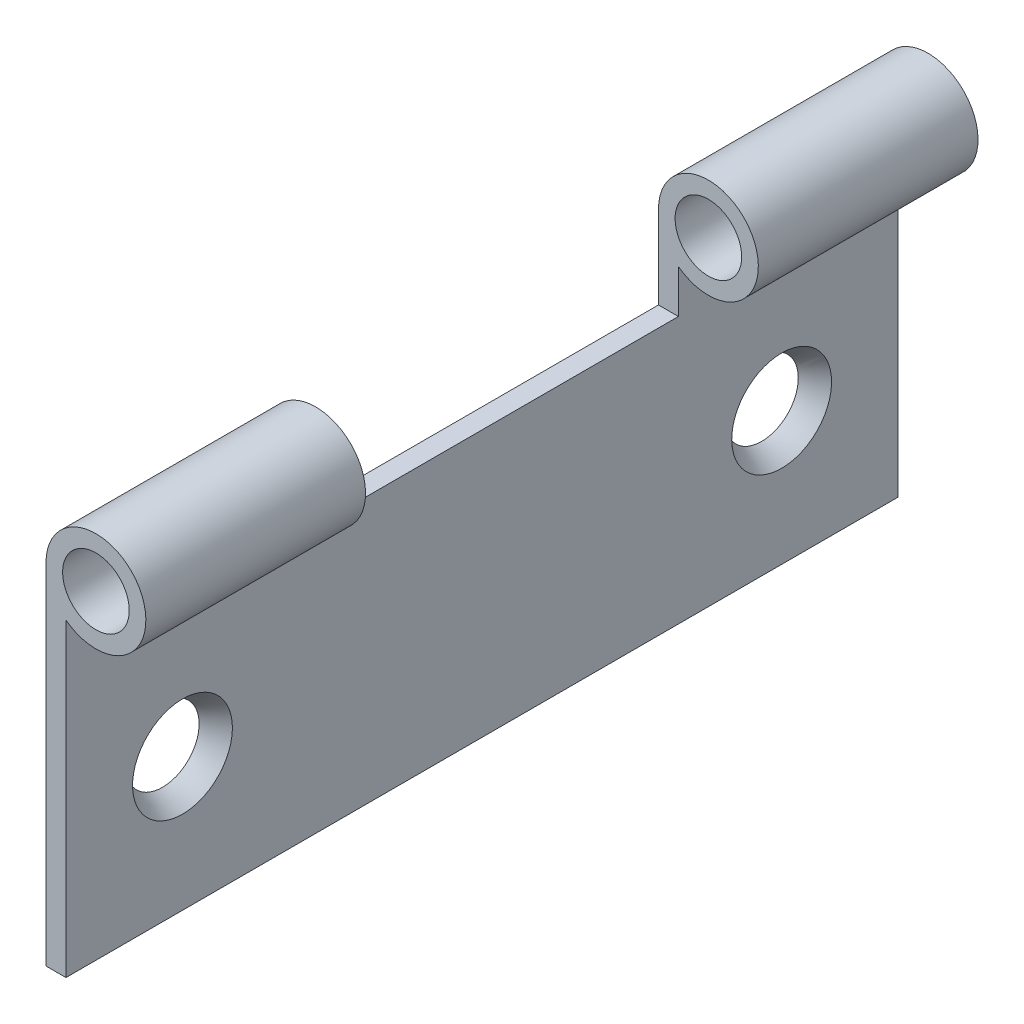
ISO-10303-21;
HEADER;
FILE_DESCRIPTION(('STEP AP214'),'2;1');
FILE_NAME('part.step','',(''),(''),'','','');
FILE_SCHEMA(('AUTOMOTIVE_DESIGN { 1 0 10303 214 1 1 1 1 }'));
ENDSEC;
DATA;
#1=APPLICATION_CONTEXT('core data for automotive mechanical design processes');
#2=APPLICATION_PROTOCOL_DEFINITION('international standard','automotive_design',2000,#1);
#3=PRODUCT_CONTEXT('',#1,'mechanical');
#4=PRODUCT('Part','Part','',(#3));
#5=PRODUCT_RELATED_PRODUCT_CATEGORY('part','',(#4));
#6=PRODUCT_DEFINITION_FORMATION('','',#4);
#7=PRODUCT_DEFINITION_CONTEXT('part definition',#1,'design');
#8=PRODUCT_DEFINITION('design','',#6,#7);
#9=PRODUCT_DEFINITION_SHAPE('','',#8);
#10=(LENGTH_UNIT() NAMED_UNIT(*) SI_UNIT(.MILLI.,.METRE.));
#11=(NAMED_UNIT(*) PLANE_ANGLE_UNIT() SI_UNIT($,.RADIAN.));
#12=(NAMED_UNIT(*) SI_UNIT($,.STERADIAN.) SOLID_ANGLE_UNIT());
#13=UNCERTAINTY_MEASURE_WITH_UNIT(LENGTH_MEASURE(1.E-05),#10,'distance_accuracy_value','');
#14=(GEOMETRIC_REPRESENTATION_CONTEXT(3) GLOBAL_UNCERTAINTY_ASSIGNED_CONTEXT((#13)) GLOBAL_UNIT_ASSIGNED_CONTEXT((#10,
#11,#12)) REPRESENTATION_CONTEXT('',''));
#15=CARTESIAN_POINT('',(0.,0.,0.));
#16=DIRECTION('',(0.,0.,1.));
#17=DIRECTION('',(1.,0.,0.));
#18=AXIS2_PLACEMENT_3D('',#15,#16,#17);
#19=CARTESIAN_POINT('',(1.5,10.5,-12.5));
#20=DIRECTION('',(0.,0.,1.));
#21=DIRECTION('',(1.,0.,0.));
#22=AXIS2_PLACEMENT_3D('',#19,#20,#21);
#23=CYLINDRICAL_SURFACE('',#22,1.5);
#24=CARTESIAN_POINT('',(1.5,10.5,5.9));
#25=DIRECTION('',(0.,0.,1.));
#26=DIRECTION('',(0.,-1.,0.));
#27=AXIS2_PLACEMENT_3D('',#24,#25,#26);
#28=CIRCLE('',#27,1.5);
#29=CARTESIAN_POINT('',(0.,10.5,5.9));
#30=VERTEX_POINT('',#29);
#31=CARTESIAN_POINT('',(0.6,9.3,5.9));
#32=VERTEX_POINT('',#31);
#33=EDGE_CURVE('E130',#30,#32,#28,.F.);
#34=ORIENTED_EDGE('',*,*,#33,.F.);
#35=DIRECTION('',(0.,0.,-1.));
#36=VECTOR('',#35,1.);
#37=CARTESIAN_POINT('',(0.,10.5,12.5));
#38=LINE('',#37,#36);
#39=CARTESIAN_POINT('',(0.,10.5,12.5));
#40=VERTEX_POINT('',#39);
#41=EDGE_CURVE('E47',#40,#30,#38,.T.);
#42=ORIENTED_EDGE('',*,*,#41,.F.);
#43=CARTESIAN_POINT('',(1.5,10.5,12.5));
#44=DIRECTION('',(0.,0.,1.));
#45=DIRECTION('',(1.,0.,0.));
#46=AXIS2_PLACEMENT_3D('',#43,#44,#45);
#47=CIRCLE('',#46,1.5);
#48=CARTESIAN_POINT('',(0.6,9.3,12.5));
#49=VERTEX_POINT('',#48);
#50=EDGE_CURVE('E145',#49,#40,#47,.T.);
#51=ORIENTED_EDGE('',*,*,#50,.F.);
#52=DIRECTION('',(0.,0.,1.));
#53=VECTOR('',#52,1.);
#54=CARTESIAN_POINT('',(0.6,9.3,-12.5));
#55=LINE('',#54,#53);
#56=EDGE_CURVE('E151',#32,#49,#55,.T.);
#57=ORIENTED_EDGE('',*,*,#56,.F.);
#58=EDGE_LOOP('',(#34,#42,#51,#57));
#59=FACE_BOUND('',#58,.T.);
#60=ADVANCED_FACE('F36',(#59),#23,.T.);
#61=CARTESIAN_POINT('',(1.5,10.5,-12.5));
#62=DIRECTION('',(0.,0.,1.));
#63=DIRECTION('',(1.,0.,0.));
#64=AXIS2_PLACEMENT_3D('',#61,#62,#63);
#65=CYLINDRICAL_SURFACE('',#64,1.);
#66=CARTESIAN_POINT('',(1.5,10.5,5.9));
#67=DIRECTION('',(0.,0.,1.));
#68=DIRECTION('',(0.,-1.,0.));
#69=AXIS2_PLACEMENT_3D('',#66,#67,#68);
#70=CIRCLE('',#69,1.);
#71=CARTESIAN_POINT('',(1.5,9.5,5.9));
#72=VERTEX_POINT('',#71);
#73=EDGE_CURVE('E134',#72,#72,#70,.F.);
#74=ORIENTED_EDGE('',*,*,#73,.T.);
#75=EDGE_LOOP('',(#74));
#76=FACE_BOUND('',#75,.T.);
#77=CARTESIAN_POINT('',(1.5,10.5,12.5));
#78=DIRECTION('',(0.,0.,1.));
#79=DIRECTION('',(1.,0.,0.));
#80=AXIS2_PLACEMENT_3D('',#77,#78,#79);
#81=CIRCLE('',#80,1.);
#82=CARTESIAN_POINT('',(2.5,10.5,12.5));
#83=VERTEX_POINT('',#82);
#84=EDGE_CURVE('E139',#83,#83,#81,.T.);
#85=ORIENTED_EDGE('',*,*,#84,.T.);
#86=EDGE_LOOP('',(#85));
#87=FACE_BOUND('',#86,.T.);
#88=ADVANCED_FACE('F293',(#76,#87),#65,.F.);
#89=CARTESIAN_POINT('',(0.6,0.,12.5));
#90=DIRECTION('',(-1.,0.,0.));
#91=DIRECTION('',(0.,0.,1.));
#92=AXIS2_PLACEMENT_3D('',#89,#90,#91);
#93=PLANE('',#92);
#94=CARTESIAN_POINT('',(0.6,4.,-9.));
#95=DIRECTION('',(-1.,0.,0.));
#96=DIRECTION('',(0.,0.,1.));
#97=AXIS2_PLACEMENT_3D('',#94,#95,#96);
#98=CIRCLE('',#97,1.5);
#99=CARTESIAN_POINT('',(0.6,4.81564072416819,-10.2588606789786));
#100=VERTEX_POINT('',#99);
#101=EDGE_CURVE('E215',#100,#100,#98,.T.);
#102=ORIENTED_EDGE('',*,*,#101,.T.);
#103=EDGE_LOOP('',(#102));
#104=FACE_BOUND('',#103,.T.);
#105=CARTESIAN_POINT('',(0.6,4.,9.));
#106=DIRECTION('',(1.,0.,0.));
#107=DIRECTION('',(0.,0.,-1.));
#108=AXIS2_PLACEMENT_3D('',#105,#106,#107);
#109=CIRCLE('',#108,1.5);
#110=CARTESIAN_POINT('',(0.6,4.81564072416819,10.2588606789786));
#111=VERTEX_POINT('',#110);
#112=EDGE_CURVE('E221',#111,#111,#109,.T.);
#113=ORIENTED_EDGE('',*,*,#112,.F.);
#114=EDGE_LOOP('',(#113));
#115=FACE_BOUND('',#114,.T.);
#116=DIRECTION('',(0.,0.,1.));
#117=VECTOR('',#116,1.);
#118=CARTESIAN_POINT('',(0.6,8.,12.5));
#119=LINE('',#118,#117);
#120=CARTESIAN_POINT('',(0.600000000000003,8.,-5.9));
#121=VERTEX_POINT('',#120);
#122=CARTESIAN_POINT('',(0.600000000000003,8.,5.9));
#123=VERTEX_POINT('',#122);
#124=EDGE_CURVE('E118',#121,#123,#119,.T.);
#125=ORIENTED_EDGE('',*,*,#124,.T.);
#126=DIRECTION('',(0.,1.,0.));
#127=VECTOR('',#126,1.);
#128=CARTESIAN_POINT('',(0.6,0.,5.9));
#129=LINE('',#128,#127);
#130=EDGE_CURVE('E129',#123,#32,#129,.T.);
#131=ORIENTED_EDGE('',*,*,#130,.T.);
#132=ORIENTED_EDGE('',*,*,#56,.T.);
#133=DIRECTION('',(0.,1.,0.));
#134=VECTOR('',#133,1.);
#135=CARTESIAN_POINT('',(0.6,0.,12.5));
#136=LINE('',#135,#134);
#137=CARTESIAN_POINT('',(0.6,0.,12.5));
#138=VERTEX_POINT('',#137);
#139=EDGE_CURVE('E164',#138,#49,#136,.T.);
#140=ORIENTED_EDGE('',*,*,#139,.F.);
#141=DIRECTION('',(0.,0.,-1.));
#142=VECTOR('',#141,1.);
#143=CARTESIAN_POINT('',(0.6,0.,12.5));
#144=LINE('',#143,#142);
#145=CARTESIAN_POINT('',(0.6,0.,-12.5));
#146=VERTEX_POINT('',#145);
#147=EDGE_CURVE('E63',#138,#146,#144,.T.);
#148=ORIENTED_EDGE('',*,*,#147,.T.);
#149=DIRECTION('',(0.,1.,0.));
#150=VECTOR('',#149,1.);
#151=CARTESIAN_POINT('',(0.6,0.,-12.5));
#152=LINE('',#151,#150);
#153=CARTESIAN_POINT('',(0.6,9.3,-12.5));
#154=VERTEX_POINT('',#153);
#155=EDGE_CURVE('E155',#146,#154,#152,.T.);
#156=ORIENTED_EDGE('',*,*,#155,.T.);
#157=CARTESIAN_POINT('',(0.6,9.3,-5.9));
#158=VERTEX_POINT('',#157);
#159=EDGE_CURVE('E152',#154,#158,#55,.T.);
#160=ORIENTED_EDGE('',*,*,#159,.T.);
#161=DIRECTION('',(0.,-1.,0.));
#162=VECTOR('',#161,1.);
#163=CARTESIAN_POINT('',(0.6,0.,-5.9));
#164=LINE('',#163,#162);
#165=EDGE_CURVE('E55',#158,#121,#164,.T.);
#166=ORIENTED_EDGE('',*,*,#165,.T.);
#167=EDGE_LOOP('',(#125,#131,#132,#140,#148,#156,#160,#166));
#168=FACE_BOUND('',#167,.T.);
#169=ADVANCED_FACE('F38',(#104,#115,#168),#93,.F.);
#170=CARTESIAN_POINT('',(0.,0.,12.5));
#171=DIRECTION('',(-1.,0.,0.));
#172=DIRECTION('',(0.,0.,1.));
#173=AXIS2_PLACEMENT_3D('',#170,#171,#172);
#174=PLANE('',#173);
#175=CARTESIAN_POINT('',(0.,4.,-9.));
#176=DIRECTION('',(1.,0.,0.));
#177=DIRECTION('',(0.,0.,-1.));
#178=AXIS2_PLACEMENT_3D('',#175,#176,#177);
#179=CIRCLE('',#178,1.1);
#180=CARTESIAN_POINT('',(0.,4.27422825846248,-10.0652693848321));
#181=VERTEX_POINT('',#180);
#182=EDGE_CURVE('E219',#181,#181,#179,.T.);
#183=ORIENTED_EDGE('',*,*,#182,.T.);
#184=EDGE_LOOP('',(#183));
#185=FACE_BOUND('',#184,.T.);
#186=CARTESIAN_POINT('',(0.,4.,9.));
#187=DIRECTION('',(-1.,0.,0.));
#188=DIRECTION('',(0.,0.,1.));
#189=AXIS2_PLACEMENT_3D('',#186,#187,#188);
#190=CIRCLE('',#189,1.1);
#191=CARTESIAN_POINT('',(0.,4.27422825846248,10.0652693848321));
#192=VERTEX_POINT('',#191);
#193=EDGE_CURVE('E184',#192,#192,#190,.T.);
#194=ORIENTED_EDGE('',*,*,#193,.F.);
#195=EDGE_LOOP('',(#194));
#196=FACE_BOUND('',#195,.T.);
#197=DIRECTION('',(0.,1.,0.));
#198=VECTOR('',#197,1.);
#199=CARTESIAN_POINT('',(0.,0.,5.9));
#200=LINE('',#199,#198);
#201=CARTESIAN_POINT('',(0.,8.,5.9));
#202=VERTEX_POINT('',#201);
#203=EDGE_CURVE('E125',#202,#30,#200,.T.);
#204=ORIENTED_EDGE('',*,*,#203,.F.);
#205=DIRECTION('',(0.,0.,1.));
#206=VECTOR('',#205,1.);
#207=CARTESIAN_POINT('',(0.,8.,12.5));
#208=LINE('',#207,#206);
#209=CARTESIAN_POINT('',(0.,8.,-5.9));
#210=VERTEX_POINT('',#209);
#211=EDGE_CURVE('E12',#210,#202,#208,.T.);
#212=ORIENTED_EDGE('',*,*,#211,.F.);
#213=DIRECTION('',(0.,-1.,0.));
#214=VECTOR('',#213,1.);
#215=CARTESIAN_POINT('',(0.,0.,-5.9));
#216=LINE('',#215,#214);
#217=CARTESIAN_POINT('',(0.,10.5,-5.9));
#218=VERTEX_POINT('',#217);
#219=EDGE_CURVE('E104',#218,#210,#216,.T.);
#220=ORIENTED_EDGE('',*,*,#219,.F.);
#221=CARTESIAN_POINT('',(0.,10.5,-12.5));
#222=VERTEX_POINT('',#221);
#223=EDGE_CURVE('E174',#218,#222,#38,.T.);
#224=ORIENTED_EDGE('',*,*,#223,.T.);
#225=DIRECTION('',(0.,1.,0.));
#226=VECTOR('',#225,1.);
#227=CARTESIAN_POINT('',(0.,0.,-12.5));
#228=LINE('',#227,#226);
#229=CARTESIAN_POINT('',(0.,0.,-12.5));
#230=VERTEX_POINT('',#229);
#231=EDGE_CURVE('E158',#230,#222,#228,.T.);
#232=ORIENTED_EDGE('',*,*,#231,.F.);
#233=DIRECTION('',(0.,0.,-1.));
#234=VECTOR('',#233,1.);
#235=CARTESIAN_POINT('',(0.,0.,12.5));
#236=LINE('',#235,#234);
#237=CARTESIAN_POINT('',(0.,0.,12.5));
#238=VERTEX_POINT('',#237);
#239=EDGE_CURVE('E172',#238,#230,#236,.T.);
#240=ORIENTED_EDGE('',*,*,#239,.F.);
#241=DIRECTION('',(0.,1.,0.));
#242=VECTOR('',#241,1.);
#243=CARTESIAN_POINT('',(0.,0.,12.5));
#244=LINE('',#243,#242);
#245=EDGE_CURVE('E167',#238,#40,#244,.T.);
#246=ORIENTED_EDGE('',*,*,#245,.T.);
#247=ORIENTED_EDGE('',*,*,#41,.T.);
#248=EDGE_LOOP('',(#204,#212,#220,#224,#232,#240,#246,#247));
#249=FACE_BOUND('',#248,.T.);
#250=ADVANCED_FACE('F123',(#185,#196,#249),#174,.T.);
#251=CARTESIAN_POINT('',(0.6,0.,12.5));
#252=DIRECTION('',(0.,-1.,0.));
#253=DIRECTION('',(0.,0.,-1.));
#254=AXIS2_PLACEMENT_3D('',#251,#252,#253);
#255=PLANE('',#254);
#256=DIRECTION('',(-1.,0.,0.));
#257=VECTOR('',#256,1.);
#258=CARTESIAN_POINT('',(0.6,0.,-12.5));
#259=LINE('',#258,#257);
#260=EDGE_CURVE('E161',#146,#230,#259,.T.);
#261=ORIENTED_EDGE('',*,*,#260,.F.);
#262=ORIENTED_EDGE('',*,*,#147,.F.);
#263=DIRECTION('',(-1.,0.,0.));
#264=VECTOR('',#263,1.);
#265=CARTESIAN_POINT('',(0.6,0.,12.5));
#266=LINE('',#265,#264);
#267=EDGE_CURVE('E169',#138,#238,#266,.T.);
#268=ORIENTED_EDGE('',*,*,#267,.T.);
#269=ORIENTED_EDGE('',*,*,#239,.T.);
#270=EDGE_LOOP('',(#261,#262,#268,#269));
#271=FACE_BOUND('',#270,.T.);
#272=ADVANCED_FACE('F198',(#271),#255,.T.);
#273=CARTESIAN_POINT('',(0.6,10.5,12.5));
#274=DIRECTION('',(0.,0.,-1.));
#275=DIRECTION('',(-1.,0.,0.));
#276=AXIS2_PLACEMENT_3D('',#273,#274,#275);
#277=PLANE('',#276);
#278=ORIENTED_EDGE('',*,*,#84,.F.);
#279=EDGE_LOOP('',(#278));
#280=FACE_BOUND('',#279,.T.);
#281=ORIENTED_EDGE('',*,*,#139,.T.);
#282=ORIENTED_EDGE('',*,*,#50,.T.);
#283=ORIENTED_EDGE('',*,*,#245,.F.);
#284=ORIENTED_EDGE('',*,*,#267,.F.);
#285=EDGE_LOOP('',(#281,#282,#283,#284));
#286=FACE_BOUND('',#285,.T.);
#287=ADVANCED_FACE('F285',(#280,#286),#277,.F.);
#288=CARTESIAN_POINT('',(0.6,10.5,-12.5));
#289=DIRECTION('',(0.,0.,-1.));
#290=DIRECTION('',(-1.,0.,0.));
#291=AXIS2_PLACEMENT_3D('',#288,#289,#290);
#292=PLANE('',#291);
#293=CARTESIAN_POINT('',(1.5,10.5,-12.5));
#294=DIRECTION('',(0.,0.,1.));
#295=DIRECTION('',(1.,0.,0.));
#296=AXIS2_PLACEMENT_3D('',#293,#294,#295);
#297=CIRCLE('',#296,1.);
#298=CARTESIAN_POINT('',(2.5,10.5,-12.5));
#299=VERTEX_POINT('',#298);
#300=EDGE_CURVE('E142',#299,#299,#297,.T.);
#301=ORIENTED_EDGE('',*,*,#300,.T.);
#302=EDGE_LOOP('',(#301));
#303=FACE_BOUND('',#302,.T.);
#304=ORIENTED_EDGE('',*,*,#231,.T.);
#305=CARTESIAN_POINT('',(1.5,10.5,-12.5));
#306=DIRECTION('',(0.,0.,1.));
#307=DIRECTION('',(1.,0.,0.));
#308=AXIS2_PLACEMENT_3D('',#305,#306,#307);
#309=CIRCLE('',#308,1.5);
#310=EDGE_CURVE('E148',#154,#222,#309,.T.);
#311=ORIENTED_EDGE('',*,*,#310,.F.);
#312=ORIENTED_EDGE('',*,*,#155,.F.);
#313=ORIENTED_EDGE('',*,*,#260,.T.);
#314=EDGE_LOOP('',(#304,#311,#312,#313));
#315=FACE_BOUND('',#314,.T.);
#316=ADVANCED_FACE('F280',(#303,#315),#292,.T.);
#317=CARTESIAN_POINT('',(1.5,10.5,-5.9));
#318=DIRECTION('',(0.,0.,-1.));
#319=DIRECTION('',(0.,1.,0.));
#320=AXIS2_PLACEMENT_3D('',#317,#318,#319);
#321=CIRCLE('',#320,1.5);
#322=EDGE_CURVE('E108',#158,#218,#321,.F.);
#323=ORIENTED_EDGE('',*,*,#322,.F.);
#324=ORIENTED_EDGE('',*,*,#159,.F.);
#325=ORIENTED_EDGE('',*,*,#310,.T.);
#326=ORIENTED_EDGE('',*,*,#223,.F.);
#327=EDGE_LOOP('',(#323,#324,#325,#326));
#328=FACE_BOUND('',#327,.T.);
#329=ADVANCED_FACE('F278',(#328),#23,.T.);
#330=CARTESIAN_POINT('',(1.5,10.5,-5.9));
#331=DIRECTION('',(0.,0.,-1.));
#332=DIRECTION('',(0.,1.,0.));
#333=AXIS2_PLACEMENT_3D('',#330,#331,#332);
#334=CIRCLE('',#333,1.);
#335=CARTESIAN_POINT('',(1.5,11.5,-5.9));
#336=VERTEX_POINT('',#335);
#337=EDGE_CURVE('E119',#336,#336,#334,.F.);
#338=ORIENTED_EDGE('',*,*,#337,.T.);
#339=EDGE_LOOP('',(#338));
#340=FACE_BOUND('',#339,.T.);
#341=ORIENTED_EDGE('',*,*,#300,.F.);
#342=EDGE_LOOP('',(#341));
#343=FACE_BOUND('',#342,.T.);
#344=ADVANCED_FACE('F301',(#340,#343),#65,.F.);
#345=CARTESIAN_POINT('',(-59.4,8.,5.9));
#346=DIRECTION('',(0.,-1.,0.));
#347=DIRECTION('',(0.,0.,-1.));
#348=AXIS2_PLACEMENT_3D('',#345,#346,#347);
#349=PLANE('',#348);
#350=DIRECTION('',(1.,0.,0.));
#351=VECTOR('',#350,1.);
#352=CARTESIAN_POINT('',(-59.4,8.,-5.9));
#353=LINE('',#352,#351);
#354=EDGE_CURVE('E107',#210,#121,#353,.T.);
#355=ORIENTED_EDGE('',*,*,#354,.F.);
#356=ORIENTED_EDGE('',*,*,#211,.T.);
#357=DIRECTION('',(1.,0.,0.));
#358=VECTOR('',#357,1.);
#359=CARTESIAN_POINT('',(-59.4,8.,5.9));
#360=LINE('',#359,#358);
#361=EDGE_CURVE('E120',#202,#123,#360,.T.);
#362=ORIENTED_EDGE('',*,*,#361,.T.);
#363=ORIENTED_EDGE('',*,*,#124,.F.);
#364=EDGE_LOOP('',(#355,#356,#362,#363));
#365=FACE_BOUND('',#364,.T.);
#366=ADVANCED_FACE('F114',(#365),#349,.F.);
#367=CARTESIAN_POINT('',(-59.4,14.,5.9));
#368=DIRECTION('',(0.,0.,1.));
#369=DIRECTION('',(0.,-1.,0.));
#370=AXIS2_PLACEMENT_3D('',#367,#368,#369);
#371=PLANE('',#370);
#372=ORIENTED_EDGE('',*,*,#73,.F.);
#373=EDGE_LOOP('',(#372));
#374=FACE_BOUND('',#373,.T.);
#375=ORIENTED_EDGE('',*,*,#361,.F.);
#376=ORIENTED_EDGE('',*,*,#203,.T.);
#377=ORIENTED_EDGE('',*,*,#33,.T.);
#378=ORIENTED_EDGE('',*,*,#130,.F.);
#379=EDGE_LOOP('',(#375,#376,#377,#378));
#380=FACE_BOUND('',#379,.T.);
#381=ADVANCED_FACE('F363',(#374,#380),#371,.F.);
#382=CARTESIAN_POINT('',(-59.4,14.,-5.9));
#383=DIRECTION('',(0.,0.,-1.));
#384=DIRECTION('',(0.,1.,0.));
#385=AXIS2_PLACEMENT_3D('',#382,#383,#384);
#386=PLANE('',#385);
#387=ORIENTED_EDGE('',*,*,#337,.F.);
#388=EDGE_LOOP('',(#387));
#389=FACE_BOUND('',#388,.T.);
#390=ORIENTED_EDGE('',*,*,#322,.T.);
#391=ORIENTED_EDGE('',*,*,#219,.T.);
#392=ORIENTED_EDGE('',*,*,#354,.T.);
#393=ORIENTED_EDGE('',*,*,#165,.F.);
#394=EDGE_LOOP('',(#390,#391,#392,#393));
#395=FACE_BOUND('',#394,.T.);
#396=ADVANCED_FACE('F106',(#389,#395),#386,.F.);
#397=CARTESIAN_POINT('',(0.,4.27422825846248,10.0652693848321));
#398=CARTESIAN_POINT('',(0.6,4.81564072416819,10.2588606789786));
#399=CARTESIAN_POINT('',(0.,2.14368948879821,10.6137259017571));
#400=CARTESIAN_POINT('',(0.6,2.29791936621104,11.8901421273149));
#401=CARTESIAN_POINT('',(0.,1.59523297187325,8.48318713209283));
#402=CARTESIAN_POINT('',(0.6,0.666637917874665,9.3724207693578));
#403=CARTESIAN_POINT('',(0.,3.72577174153752,7.93473061516786));
#404=CARTESIAN_POINT('',(0.6,3.18435927583181,7.74113932102142));
#405=CARTESIAN_POINT('',(0.,5.85631051120179,7.38627409824289));
#406=CARTESIAN_POINT('',(0.6,5.70208063378896,6.10985787268505));
#407=CARTESIAN_POINT('',(0.,6.40476702812675,9.51681286790717));
#408=CARTESIAN_POINT('',(0.6,7.33336208212534,8.62757923064219));
#409=CARTESIAN_POINT('',(0.,4.27422825846248,10.0652693848321));
#410=CARTESIAN_POINT('',(0.6,4.81564072416819,10.2588606789786));
#411=(BOUNDED_SURFACE() B_SPLINE_SURFACE(3,1,((#397,#398),(#399,#400),(#401,#402),(#403,#404),
(#405,#406),(#407,#408),(#409,#410)),.UNSPECIFIED.,.T.,.F.,.F.) B_SPLINE_SURFACE_WITH_KNOTS((4,
3,4),(2,2),(0.,0.5,1.),(0.,1.),
.UNSPECIFIED.) GEOMETRIC_REPRESENTATION_ITEM() RATIONAL_B_SPLINE_SURFACE(((1.,1.),
(0.333333333333333,0.333333333333333),(0.333333333333333,0.333333333333333),(1.,1.),
(0.333333333333333,0.333333333333333),(0.333333333333333,0.333333333333333),(1.,1.))) REPRESENTATION_ITEM('') SURFACE());
#412=CARTESIAN_POINT('',(0.,4.27422825846248,10.0652693848321));
#413=CARTESIAN_POINT('',(0.00625000000000054,4.27986797164692,10.0672859608128));
#414=CARTESIAN_POINT('',(0.0125000000000004,4.28550768483135,10.0693025367935));
#415=CARTESIAN_POINT('',(0.025,4.29678711120022,10.0733356887549));
#416=CARTESIAN_POINT('',(0.0312499999999998,4.30242682438466,10.0753522647356));
#417=CARTESIAN_POINT('',(0.0437499999999998,4.31370625075353,10.079385416697));
#418=CARTESIAN_POINT('',(0.05,4.31934596393796,10.0814019926777));
#419=CARTESIAN_POINT('',(0.0625000000000001,4.33062539030683,10.0854351446391));
#420=CARTESIAN_POINT('',(0.06875,4.33626510349126,10.0874517206197));
#421=CARTESIAN_POINT('',(0.08125,4.34754452986013,10.0914848725811));
#422=CARTESIAN_POINT('',(0.0875,4.35318424304457,10.0935014485618));
#423=CARTESIAN_POINT('',(0.1,4.36446366941343,10.0975346005232));
#424=CARTESIAN_POINT('',(0.10625,4.37010338259787,10.0995511765039));
#425=CARTESIAN_POINT('',(0.11875,4.38138280896674,10.1035843284653));
#426=CARTESIAN_POINT('',(0.125,4.38702252215117,10.105600904446));
#427=CARTESIAN_POINT('',(0.1375,4.39830194852004,10.1096340564074));
#428=CARTESIAN_POINT('',(0.14375,4.40394166170448,10.1116506323881));
#429=CARTESIAN_POINT('',(0.15625,4.41522108807334,10.1156837843494));
#430=CARTESIAN_POINT('',(0.1625,4.42086080125778,10.1177003603301));
#431=CARTESIAN_POINT('',(0.175,4.43214022762665,10.1217335122915));
#432=CARTESIAN_POINT('',(0.18125,4.43777994081108,10.1237500882722));
#433=CARTESIAN_POINT('',(0.19375,4.44905936717995,10.1277832402336));
#434=CARTESIAN_POINT('',(0.2,4.45469908036439,10.1297998162143));
#435=CARTESIAN_POINT('',(0.2125,4.46597850673325,10.1338329681757));
#436=CARTESIAN_POINT('',(0.21875,4.47161821991769,10.1358495441564));
#437=CARTESIAN_POINT('',(0.23125,4.48289764628656,10.1398826961177));
#438=CARTESIAN_POINT('',(0.2375,4.48853735947099,10.1418992720984));
#439=CARTESIAN_POINT('',(0.25,4.49981678583986,10.1459324240598));
#440=CARTESIAN_POINT('',(0.25625,4.5054564990243,10.1479490000405));
#441=CARTESIAN_POINT('',(0.26875,4.51673592539316,10.1519821520019));
#442=CARTESIAN_POINT('',(0.275,4.5223756385776,10.1539987279826));
#443=CARTESIAN_POINT('',(0.2875,4.53365506494647,10.158031879944));
#444=CARTESIAN_POINT('',(0.29375,4.5392947781309,10.1600484559247));
#445=CARTESIAN_POINT('',(0.30625,4.55057420449977,10.164081607886));
#446=CARTESIAN_POINT('',(0.3125,4.55621391768421,10.1660981838667));
#447=CARTESIAN_POINT('',(0.325,4.56749334405307,10.1701313358281));
#448=CARTESIAN_POINT('',(0.33125,4.57313305723751,10.1721479118088));
#449=CARTESIAN_POINT('',(0.34375,4.58441248360638,10.1761810637702));
#450=CARTESIAN_POINT('',(0.35,4.59005219679081,10.1781976397509));
#451=CARTESIAN_POINT('',(0.3625,4.60133162315968,10.1822307917123));
#452=CARTESIAN_POINT('',(0.36875,4.60697133634412,10.184247367693));
#453=CARTESIAN_POINT('',(0.38125,4.61825076271298,10.1882805196544));
#454=CARTESIAN_POINT('',(0.3875,4.62389047589742,10.190297095635));
#455=CARTESIAN_POINT('',(0.4,4.63516990226629,10.1943302475964));
#456=CARTESIAN_POINT('',(0.40625,4.64080961545072,10.1963468235771));
#457=CARTESIAN_POINT('',(0.41875,4.65208904181959,10.2003799755385));
#458=CARTESIAN_POINT('',(0.425,4.65772875500403,10.2023965515192));
#459=CARTESIAN_POINT('',(0.4375,4.66900818137289,10.2064297034806));
#460=CARTESIAN_POINT('',(0.44375,4.67464789455733,10.2084462794613));
#461=CARTESIAN_POINT('',(0.45625,4.6859273209262,10.2124794314227));
#462=CARTESIAN_POINT('',(0.4625,4.69156703411063,10.2144960074033));
#463=CARTESIAN_POINT('',(0.475,4.7028464604795,10.2185291593647));
#464=CARTESIAN_POINT('',(0.48125,4.70848617366394,10.2205457353454));
#465=CARTESIAN_POINT('',(0.49375,4.7197656000328,10.2245788873068));
#466=CARTESIAN_POINT('',(0.5,4.72540531321724,10.2265954632875));
#467=CARTESIAN_POINT('',(0.5125,4.73668473958611,10.2306286152489));
#468=CARTESIAN_POINT('',(0.51875,4.74232445277054,10.2326451912296));
#469=CARTESIAN_POINT('',(0.53125,4.75360387913941,10.236678343191));
#470=CARTESIAN_POINT('',(0.5375,4.75924359232384,10.2386949191716));
#471=CARTESIAN_POINT('',(0.55,4.77052301869271,10.242728071133));
#472=CARTESIAN_POINT('',(0.55625,4.77616273187715,10.2447446471137));
#473=CARTESIAN_POINT('',(0.56875,4.78744215824602,10.2487777990751));
#474=CARTESIAN_POINT('',(0.575,4.79308187143045,10.2507943750558));
#475=CARTESIAN_POINT('',(0.5875,4.80436129779932,10.2548275270172));
#476=CARTESIAN_POINT('',(0.593749999999999,4.81000101098375,10.2568441029979));
#477=CARTESIAN_POINT('',(0.6,4.81564072416819,10.2588606789786));
#478=B_SPLINE_CURVE_WITH_KNOTS('',3,(#412,#413,#414,#415,#416,#417,#418,#419,#420,#421,#422,
#423,#424,#425,#426,#427,#428,#429,#430,#431,#432,#433,#434,#435,#436,#437,#438,#439,#440,#441,
#442,#443,#444,#445,#446,#447,#448,#449,#450,#451,#452,#453,#454,#455,#456,#457,#458,#459,#460,
#461,#462,#463,#464,#465,#466,#467,#468,#469,#470,#471,#472,#473,#474,#475,#476,#477),
.UNSPECIFIED.,.F.,.F.,(4,2,2,2,2,2,2,2,2,2,2,2,2,2,2,2,2,2,2,2,2,2,2,2,2,2,2,2,2,2,2,2,4),(0.,
0.0259695781905919,0.0519391563811853,0.0779087345717771,0.103878312762369,0.129847890952962,
0.155817469143554,0.181787047334147,0.207756625524739,0.233726203715331,0.259695781905923,
0.285665360096516,0.311634938287108,0.337604516477701,0.363574094668293,0.389543672858885,
0.415513251049477,0.44148282924007,0.467452407430663,0.493421985621255,0.519391563811847,
0.545361142002439,0.571330720193031,0.597300298383624,0.623269876574217,0.649239454764809,
0.675209032955401,0.701178611145993,0.727148189336586,0.753117767527178,0.77908734571777,
0.805056923908363,0.831026502098955),.UNSPECIFIED.);
#479=EDGE_CURVE('BSEAM236',#192,#111,#478,.T.);
#480=ORIENTED_EDGE('',*,*,#193,.T.);
#481=ORIENTED_EDGE('',*,*,#112,.T.);
#482=ORIENTED_EDGE('',*,*,#479,.T.);
#483=ORIENTED_EDGE('',*,*,#479,.F.);
#484=EDGE_LOOP('',(#480,#482,#481,#483));
#485=FACE_BOUND('',#484,.T.);
#486=ADVANCED_FACE('F236',(#485),#411,.F.);
#487=CARTESIAN_POINT('',(0.,4.27422825846248,-10.0652693848321));
#488=CARTESIAN_POINT('',(0.6,4.81564072416819,-10.2588606789786));
#489=CARTESIAN_POINT('',(0.,2.14368948879821,-10.6137259017571));
#490=CARTESIAN_POINT('',(0.6,2.29791936621104,-11.8901421273149));
#491=CARTESIAN_POINT('',(0.,1.59523297187325,-8.48318713209283));
#492=CARTESIAN_POINT('',(0.6,0.666637917874665,-9.3724207693578));
#493=CARTESIAN_POINT('',(0.,3.72577174153752,-7.93473061516786));
#494=CARTESIAN_POINT('',(0.6,3.18435927583181,-7.74113932102142));
#495=CARTESIAN_POINT('',(0.,5.85631051120179,-7.38627409824289));
#496=CARTESIAN_POINT('',(0.6,5.70208063378896,-6.10985787268505));
#497=CARTESIAN_POINT('',(0.,6.40476702812675,-9.51681286790717));
#498=CARTESIAN_POINT('',(0.6,7.33336208212534,-8.62757923064219));
#499=CARTESIAN_POINT('',(0.,4.27422825846248,-10.0652693848321));
#500=CARTESIAN_POINT('',(0.6,4.81564072416819,-10.2588606789786));
#501=(BOUNDED_SURFACE() B_SPLINE_SURFACE(3,1,((#487,#488),(#489,#490),(#491,#492),(#493,#494),
(#495,#496),(#497,#498),(#499,#500)),.UNSPECIFIED.,.T.,.F.,.F.) B_SPLINE_SURFACE_WITH_KNOTS((4,
3,4),(2,2),(0.,0.5,1.),(0.,1.),
.UNSPECIFIED.) GEOMETRIC_REPRESENTATION_ITEM() RATIONAL_B_SPLINE_SURFACE(((1.,1.),
(0.333333333333333,0.333333333333333),(0.333333333333333,0.333333333333333),(1.,1.),
(0.333333333333333,0.333333333333333),(0.333333333333333,0.333333333333333),(1.,1.))) REPRESENTATION_ITEM('') SURFACE());
#502=CARTESIAN_POINT('',(0.,4.27422825846248,-10.0652693848321));
#503=CARTESIAN_POINT('',(0.00625000000000054,4.27986797164692,-10.0672859608128));
#504=CARTESIAN_POINT('',(0.0125000000000004,4.28550768483135,-10.0693025367935));
#505=CARTESIAN_POINT('',(0.025,4.29678711120022,-10.0733356887549));
#506=CARTESIAN_POINT('',(0.0312499999999998,4.30242682438466,-10.0753522647356));
#507=CARTESIAN_POINT('',(0.0437499999999998,4.31370625075353,-10.079385416697));
#508=CARTESIAN_POINT('',(0.05,4.31934596393796,-10.0814019926777));
#509=CARTESIAN_POINT('',(0.0625000000000001,4.33062539030683,-10.0854351446391));
#510=CARTESIAN_POINT('',(0.06875,4.33626510349126,-10.0874517206197));
#511=CARTESIAN_POINT('',(0.08125,4.34754452986013,-10.0914848725811));
#512=CARTESIAN_POINT('',(0.0875,4.35318424304457,-10.0935014485618));
#513=CARTESIAN_POINT('',(0.1,4.36446366941343,-10.0975346005232));
#514=CARTESIAN_POINT('',(0.10625,4.37010338259787,-10.0995511765039));
#515=CARTESIAN_POINT('',(0.11875,4.38138280896674,-10.1035843284653));
#516=CARTESIAN_POINT('',(0.125,4.38702252215117,-10.105600904446));
#517=CARTESIAN_POINT('',(0.1375,4.39830194852004,-10.1096340564074));
#518=CARTESIAN_POINT('',(0.14375,4.40394166170448,-10.1116506323881));
#519=CARTESIAN_POINT('',(0.15625,4.41522108807334,-10.1156837843494));
#520=CARTESIAN_POINT('',(0.1625,4.42086080125778,-10.1177003603301));
#521=CARTESIAN_POINT('',(0.175,4.43214022762665,-10.1217335122915));
#522=CARTESIAN_POINT('',(0.18125,4.43777994081108,-10.1237500882722));
#523=CARTESIAN_POINT('',(0.19375,4.44905936717995,-10.1277832402336));
#524=CARTESIAN_POINT('',(0.2,4.45469908036439,-10.1297998162143));
#525=CARTESIAN_POINT('',(0.2125,4.46597850673325,-10.1338329681757));
#526=CARTESIAN_POINT('',(0.21875,4.47161821991769,-10.1358495441564));
#527=CARTESIAN_POINT('',(0.23125,4.48289764628656,-10.1398826961177));
#528=CARTESIAN_POINT('',(0.2375,4.48853735947099,-10.1418992720984));
#529=CARTESIAN_POINT('',(0.25,4.49981678583986,-10.1459324240598));
#530=CARTESIAN_POINT('',(0.25625,4.5054564990243,-10.1479490000405));
#531=CARTESIAN_POINT('',(0.26875,4.51673592539316,-10.1519821520019));
#532=CARTESIAN_POINT('',(0.275,4.5223756385776,-10.1539987279826));
#533=CARTESIAN_POINT('',(0.2875,4.53365506494647,-10.158031879944));
#534=CARTESIAN_POINT('',(0.29375,4.5392947781309,-10.1600484559247));
#535=CARTESIAN_POINT('',(0.30625,4.55057420449977,-10.164081607886));
#536=CARTESIAN_POINT('',(0.3125,4.55621391768421,-10.1660981838667));
#537=CARTESIAN_POINT('',(0.325,4.56749334405307,-10.1701313358281));
#538=CARTESIAN_POINT('',(0.33125,4.57313305723751,-10.1721479118088));
#539=CARTESIAN_POINT('',(0.34375,4.58441248360638,-10.1761810637702));
#540=CARTESIAN_POINT('',(0.35,4.59005219679081,-10.1781976397509));
#541=CARTESIAN_POINT('',(0.3625,4.60133162315968,-10.1822307917123));
#542=CARTESIAN_POINT('',(0.36875,4.60697133634412,-10.184247367693));
#543=CARTESIAN_POINT('',(0.38125,4.61825076271298,-10.1882805196544));
#544=CARTESIAN_POINT('',(0.3875,4.62389047589742,-10.190297095635));
#545=CARTESIAN_POINT('',(0.4,4.63516990226629,-10.1943302475964));
#546=CARTESIAN_POINT('',(0.40625,4.64080961545072,-10.1963468235771));
#547=CARTESIAN_POINT('',(0.41875,4.65208904181959,-10.2003799755385));
#548=CARTESIAN_POINT('',(0.425,4.65772875500403,-10.2023965515192));
#549=CARTESIAN_POINT('',(0.4375,4.66900818137289,-10.2064297034806));
#550=CARTESIAN_POINT('',(0.44375,4.67464789455733,-10.2084462794613));
#551=CARTESIAN_POINT('',(0.45625,4.6859273209262,-10.2124794314227));
#552=CARTESIAN_POINT('',(0.4625,4.69156703411063,-10.2144960074033));
#553=CARTESIAN_POINT('',(0.475,4.7028464604795,-10.2185291593647));
#554=CARTESIAN_POINT('',(0.48125,4.70848617366394,-10.2205457353454));
#555=CARTESIAN_POINT('',(0.49375,4.7197656000328,-10.2245788873068));
#556=CARTESIAN_POINT('',(0.5,4.72540531321724,-10.2265954632875));
#557=CARTESIAN_POINT('',(0.5125,4.73668473958611,-10.2306286152489));
#558=CARTESIAN_POINT('',(0.51875,4.74232445277054,-10.2326451912296));
#559=CARTESIAN_POINT('',(0.53125,4.75360387913941,-10.236678343191));
#560=CARTESIAN_POINT('',(0.5375,4.75924359232384,-10.2386949191716));
#561=CARTESIAN_POINT('',(0.55,4.77052301869271,-10.242728071133));
#562=CARTESIAN_POINT('',(0.55625,4.77616273187715,-10.2447446471137));
#563=CARTESIAN_POINT('',(0.56875,4.78744215824602,-10.2487777990751));
#564=CARTESIAN_POINT('',(0.575,4.79308187143045,-10.2507943750558));
#565=CARTESIAN_POINT('',(0.5875,4.80436129779932,-10.2548275270172));
#566=CARTESIAN_POINT('',(0.593749999999999,4.81000101098375,-10.2568441029979));
#567=CARTESIAN_POINT('',(0.6,4.81564072416819,-10.2588606789786));
#568=B_SPLINE_CURVE_WITH_KNOTS('',3,(#502,#503,#504,#505,#506,#507,#508,#509,#510,#511,#512,
#513,#514,#515,#516,#517,#518,#519,#520,#521,#522,#523,#524,#525,#526,#527,#528,#529,#530,#531,
#532,#533,#534,#535,#536,#537,#538,#539,#540,#541,#542,#543,#544,#545,#546,#547,#548,#549,#550,
#551,#552,#553,#554,#555,#556,#557,#558,#559,#560,#561,#562,#563,#564,#565,#566,#567),
.UNSPECIFIED.,.F.,.F.,(4,2,2,2,2,2,2,2,2,2,2,2,2,2,2,2,2,2,2,2,2,2,2,2,2,2,2,2,2,2,2,2,4),(0.,
0.0259695781905919,0.0519391563811853,0.0779087345717771,0.103878312762369,0.129847890952962,
0.155817469143554,0.181787047334147,0.207756625524739,0.233726203715331,0.259695781905923,
0.285665360096516,0.311634938287108,0.337604516477701,0.363574094668293,0.389543672858885,
0.415513251049477,0.44148282924007,0.467452407430663,0.493421985621255,0.519391563811847,
0.545361142002439,0.571330720193031,0.597300298383624,0.623269876574217,0.649239454764809,
0.675209032955401,0.701178611145993,0.727148189336586,0.753117767527178,0.77908734571777,
0.805056923908363,0.831026502098955),.UNSPECIFIED.);
#569=EDGE_CURVE('BSEAM248',#181,#100,#568,.T.);
#570=ORIENTED_EDGE('',*,*,#182,.F.);
#571=ORIENTED_EDGE('',*,*,#101,.F.);
#572=ORIENTED_EDGE('',*,*,#569,.T.);
#573=ORIENTED_EDGE('',*,*,#569,.F.);
#574=EDGE_LOOP('',(#570,#572,#571,#573));
#575=FACE_BOUND('',#574,.T.);
#576=ADVANCED_FACE('F248',(#575),#501,.T.);
#577=CLOSED_SHELL('',(#60,#88,#169,#250,#272,#287,#316,#329,#344,#366,#381,#396,#486,#576));
#578=MANIFOLD_SOLID_BREP('B2',#577);
#579=ADVANCED_BREP_SHAPE_REPRESENTATION('',(#18,#578),#14);
#580=SHAPE_DEFINITION_REPRESENTATION(#9,#579);
ENDSEC;
END-ISO-10303-21;
